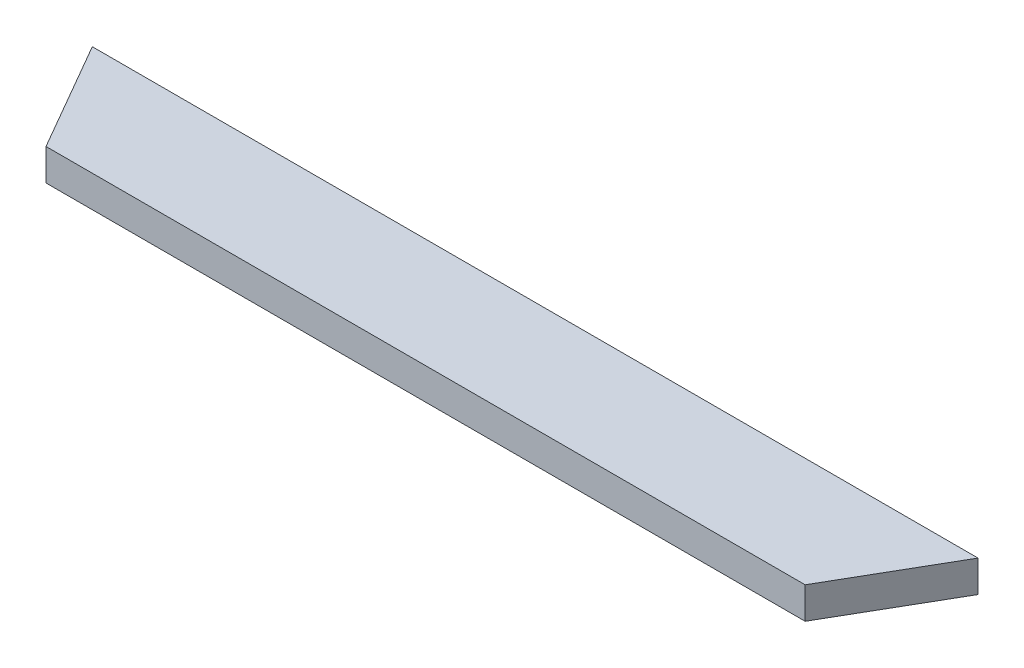
ISO-10303-21;
HEADER;
FILE_DESCRIPTION(('STEP AP214'),'2;1');
FILE_NAME('part.step','',(''),(''),'','','');
FILE_SCHEMA(('AUTOMOTIVE_DESIGN { 1 0 10303 214 1 1 1 1 }'));
ENDSEC;
DATA;
#1=APPLICATION_CONTEXT('core data for automotive mechanical design processes');
#2=APPLICATION_PROTOCOL_DEFINITION('international standard','automotive_design',2000,#1);
#3=PRODUCT_CONTEXT('',#1,'mechanical');
#4=PRODUCT('Part','Part','',(#3));
#5=PRODUCT_RELATED_PRODUCT_CATEGORY('part','',(#4));
#6=PRODUCT_DEFINITION_FORMATION('','',#4);
#7=PRODUCT_DEFINITION_CONTEXT('part definition',#1,'design');
#8=PRODUCT_DEFINITION('design','',#6,#7);
#9=PRODUCT_DEFINITION_SHAPE('','',#8);
#10=(LENGTH_UNIT() NAMED_UNIT(*) SI_UNIT(.MILLI.,.METRE.));
#11=(NAMED_UNIT(*) PLANE_ANGLE_UNIT() SI_UNIT($,.RADIAN.));
#12=(NAMED_UNIT(*) SI_UNIT($,.STERADIAN.) SOLID_ANGLE_UNIT());
#13=UNCERTAINTY_MEASURE_WITH_UNIT(LENGTH_MEASURE(1.E-05),#10,'distance_accuracy_value','');
#14=(GEOMETRIC_REPRESENTATION_CONTEXT(3) GLOBAL_UNCERTAINTY_ASSIGNED_CONTEXT((#13)) GLOBAL_UNIT_ASSIGNED_CONTEXT((#10,
#11,#12)) REPRESENTATION_CONTEXT('',''));
#15=CARTESIAN_POINT('',(0.,0.,0.));
#16=DIRECTION('',(0.,0.,1.));
#17=DIRECTION('',(1.,0.,0.));
#18=AXIS2_PLACEMENT_3D('',#15,#16,#17);
#19=CARTESIAN_POINT('',(599.999999999999,50.,1.38777878078145E-13));
#20=DIRECTION('',(-0.866025403784437,0.,-0.500000000000003));
#21=DIRECTION('',(-0.500000000000003,0.,0.866025403784437));
#22=AXIS2_PLACEMENT_3D('',#19,#20,#21);
#23=PLANE('',#22);
#24=DIRECTION('',(0.500000000000003,0.,-0.866025403784437));
#25=VECTOR('',#24,1.);
#26=CARTESIAN_POINT('',(599.999999999999,0.,1.38777878078145E-13));
#27=LINE('',#26,#25);
#28=CARTESIAN_POINT('',(599.999999999999,0.,1.38777878078145E-13));
#29=VERTEX_POINT('',#28);
#30=CARTESIAN_POINT('',(700.,0.,-173.205080756888));
#31=VERTEX_POINT('',#30);
#32=EDGE_CURVE('E96',#29,#31,#27,.T.);
#33=ORIENTED_EDGE('',*,*,#32,.T.);
#34=DIRECTION('',(0.,-1.,0.));
#35=VECTOR('',#34,1.);
#36=CARTESIAN_POINT('',(700.,50.,-173.205080756888));
#37=LINE('',#36,#35);
#38=CARTESIAN_POINT('',(700.,50.,-173.205080756888));
#39=VERTEX_POINT('',#38);
#40=EDGE_CURVE('E11',#39,#31,#37,.T.);
#41=ORIENTED_EDGE('',*,*,#40,.F.);
#42=DIRECTION('',(0.500000000000003,0.,-0.866025403784437));
#43=VECTOR('',#42,1.);
#44=CARTESIAN_POINT('',(599.999999999999,50.,1.38777878078145E-13));
#45=LINE('',#44,#43);
#46=CARTESIAN_POINT('',(599.999999999999,50.,1.38777878078145E-13));
#47=VERTEX_POINT('',#46);
#48=EDGE_CURVE('E84',#47,#39,#45,.T.);
#49=ORIENTED_EDGE('',*,*,#48,.F.);
#50=DIRECTION('',(0.,-1.,0.));
#51=VECTOR('',#50,1.);
#52=CARTESIAN_POINT('',(599.999999999999,50.,1.38777878078145E-13));
#53=LINE('',#52,#51);
#54=EDGE_CURVE('E92',#47,#29,#53,.T.);
#55=ORIENTED_EDGE('',*,*,#54,.T.);
#56=EDGE_LOOP('',(#33,#41,#49,#55));
#57=FACE_BOUND('',#56,.T.);
#58=ADVANCED_FACE('F33',(#57),#23,.F.);
#59=CARTESIAN_POINT('',(700.,50.,-173.205080756888));
#60=DIRECTION('',(0.,0.,1.));
#61=DIRECTION('',(1.,0.,0.));
#62=AXIS2_PLACEMENT_3D('',#59,#60,#61);
#63=PLANE('',#62);
#64=DIRECTION('',(-1.,0.,0.));
#65=VECTOR('',#64,1.);
#66=CARTESIAN_POINT('',(700.,0.,-173.205080756888));
#67=LINE('',#66,#65);
#68=CARTESIAN_POINT('',(-700.,0.,-173.205080756887));
#69=VERTEX_POINT('',#68);
#70=EDGE_CURVE('E88',#31,#69,#67,.T.);
#71=ORIENTED_EDGE('',*,*,#70,.T.);
#72=DIRECTION('',(0.,-1.,0.));
#73=VECTOR('',#72,1.);
#74=CARTESIAN_POINT('',(-700.,50.,-173.205080756887));
#75=LINE('',#74,#73);
#76=CARTESIAN_POINT('',(-700.,50.,-173.205080756887));
#77=VERTEX_POINT('',#76);
#78=EDGE_CURVE('E41',#77,#69,#75,.T.);
#79=ORIENTED_EDGE('',*,*,#78,.F.);
#80=DIRECTION('',(-1.,0.,0.));
#81=VECTOR('',#80,1.);
#82=CARTESIAN_POINT('',(700.,50.,-173.205080756888));
#83=LINE('',#82,#81);
#84=EDGE_CURVE('E79',#39,#77,#83,.T.);
#85=ORIENTED_EDGE('',*,*,#84,.F.);
#86=ORIENTED_EDGE('',*,*,#40,.T.);
#87=EDGE_LOOP('',(#71,#79,#85,#86));
#88=FACE_BOUND('',#87,.T.);
#89=ADVANCED_FACE('F87',(#88),#63,.F.);
#90=CARTESIAN_POINT('',(-700.,50.,-173.205080756887));
#91=DIRECTION('',(0.866025403784436,0.,-0.500000000000004));
#92=DIRECTION('',(-0.500000000000004,0.,-0.866025403784436));
#93=AXIS2_PLACEMENT_3D('',#90,#91,#92);
#94=PLANE('',#93);
#95=DIRECTION('',(0.500000000000004,0.,0.866025403784436));
#96=VECTOR('',#95,1.);
#97=CARTESIAN_POINT('',(-700.,0.,-173.205080756887));
#98=LINE('',#97,#96);
#99=CARTESIAN_POINT('',(-599.999999999999,0.,1.18459214798365E-13));
#100=VERTEX_POINT('',#99);
#101=EDGE_CURVE('E66',#69,#100,#98,.T.);
#102=ORIENTED_EDGE('',*,*,#101,.T.);
#103=DIRECTION('',(0.,-1.,0.));
#104=VECTOR('',#103,1.);
#105=CARTESIAN_POINT('',(-599.999999999999,50.,1.18459214798365E-13));
#106=LINE('',#105,#104);
#107=CARTESIAN_POINT('',(-599.999999999999,50.,1.18459214798365E-13));
#108=VERTEX_POINT('',#107);
#109=EDGE_CURVE('E89',#108,#100,#106,.T.);
#110=ORIENTED_EDGE('',*,*,#109,.F.);
#111=DIRECTION('',(0.500000000000004,0.,0.866025403784436));
#112=VECTOR('',#111,1.);
#113=CARTESIAN_POINT('',(-700.,50.,-173.205080756887));
#114=LINE('',#113,#112);
#115=EDGE_CURVE('E82',#77,#108,#114,.T.);
#116=ORIENTED_EDGE('',*,*,#115,.F.);
#117=ORIENTED_EDGE('',*,*,#78,.T.);
#118=EDGE_LOOP('',(#102,#110,#116,#117));
#119=FACE_BOUND('',#118,.T.);
#120=ADVANCED_FACE('F90',(#119),#94,.F.);
#121=CARTESIAN_POINT('',(-599.999999999999,50.,1.18459214798365E-13));
#122=DIRECTION('',(0.,0.,-1.));
#123=DIRECTION('',(-1.,0.,0.));
#124=AXIS2_PLACEMENT_3D('',#121,#122,#123);
#125=PLANE('',#124);
#126=DIRECTION('',(1.,0.,0.));
#127=VECTOR('',#126,1.);
#128=CARTESIAN_POINT('',(-599.999999999999,0.,1.18459214798365E-13));
#129=LINE('',#128,#127);
#130=EDGE_CURVE('E72',#100,#29,#129,.T.);
#131=ORIENTED_EDGE('',*,*,#130,.T.);
#132=ORIENTED_EDGE('',*,*,#54,.F.);
#133=DIRECTION('',(1.,0.,0.));
#134=VECTOR('',#133,1.);
#135=CARTESIAN_POINT('',(-599.999999999999,50.,1.18459214798365E-13));
#136=LINE('',#135,#134);
#137=EDGE_CURVE('E49',#108,#47,#136,.T.);
#138=ORIENTED_EDGE('',*,*,#137,.F.);
#139=ORIENTED_EDGE('',*,*,#109,.T.);
#140=EDGE_LOOP('',(#131,#132,#138,#139));
#141=FACE_BOUND('',#140,.T.);
#142=ADVANCED_FACE('F103',(#141),#125,.F.);
#143=CARTESIAN_POINT('',(0.,50.,0.));
#144=DIRECTION('',(0.,1.,0.));
#145=DIRECTION('',(0.,0.,1.));
#146=AXIS2_PLACEMENT_3D('',#143,#144,#145);
#147=PLANE('',#146);
#148=ORIENTED_EDGE('',*,*,#48,.T.);
#149=ORIENTED_EDGE('',*,*,#84,.T.);
#150=ORIENTED_EDGE('',*,*,#115,.T.);
#151=ORIENTED_EDGE('',*,*,#137,.T.);
#152=EDGE_LOOP('',(#148,#149,#150,#151));
#153=FACE_BOUND('',#152,.T.);
#154=ADVANCED_FACE('F80',(#153),#147,.T.);
#155=CARTESIAN_POINT('',(0.,0.,0.));
#156=DIRECTION('',(0.,1.,0.));
#157=DIRECTION('',(0.,0.,1.));
#158=AXIS2_PLACEMENT_3D('',#155,#156,#157);
#159=PLANE('',#158);
#160=ORIENTED_EDGE('',*,*,#32,.F.);
#161=ORIENTED_EDGE('',*,*,#130,.F.);
#162=ORIENTED_EDGE('',*,*,#101,.F.);
#163=ORIENTED_EDGE('',*,*,#70,.F.);
#164=EDGE_LOOP('',(#160,#161,#162,#163));
#165=FACE_BOUND('',#164,.T.);
#166=ADVANCED_FACE('F106',(#165),#159,.F.);
#167=CLOSED_SHELL('',(#58,#89,#120,#142,#154,#166));
#168=MANIFOLD_SOLID_BREP('B2',#167);
#169=ADVANCED_BREP_SHAPE_REPRESENTATION('',(#18,#168),#14);
#170=SHAPE_DEFINITION_REPRESENTATION(#9,#169);
ENDSEC;
END-ISO-10303-21;
